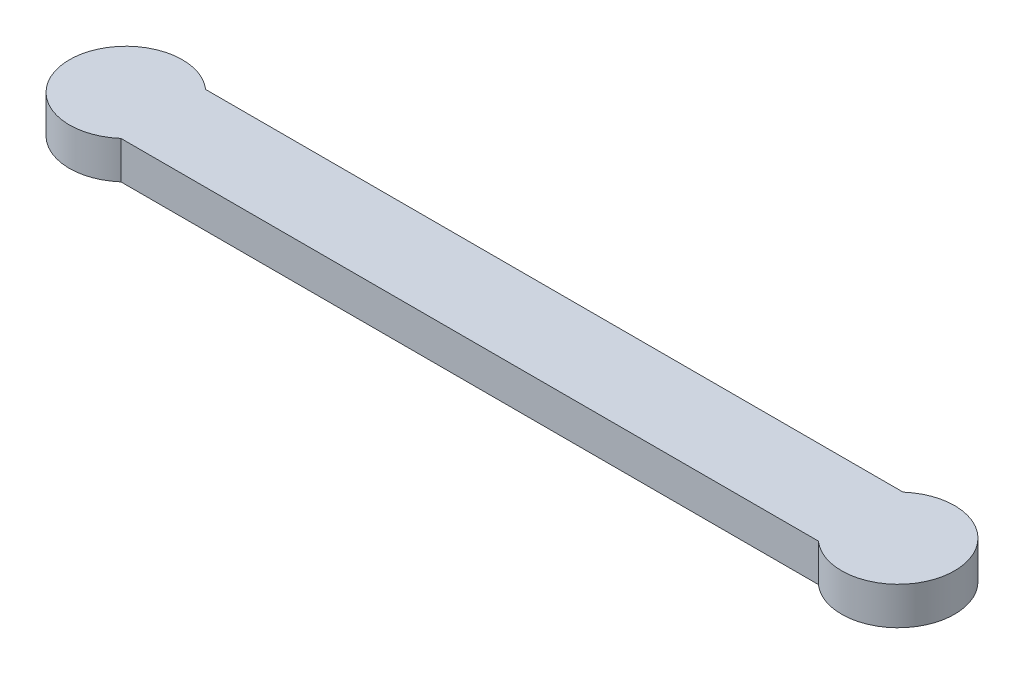
ISO-10303-21;
HEADER;
FILE_DESCRIPTION(('STEP AP214'),'2;1');
FILE_NAME('part.step','',(''),(''),'','','');
FILE_SCHEMA(('AUTOMOTIVE_DESIGN { 1 0 10303 214 1 1 1 1 }'));
ENDSEC;
DATA;
#1=APPLICATION_CONTEXT('core data for automotive mechanical design processes');
#2=APPLICATION_PROTOCOL_DEFINITION('international standard','automotive_design',2000,#1);
#3=PRODUCT_CONTEXT('',#1,'mechanical');
#4=PRODUCT('Part','Part','',(#3));
#5=PRODUCT_RELATED_PRODUCT_CATEGORY('part','',(#4));
#6=PRODUCT_DEFINITION_FORMATION('','',#4);
#7=PRODUCT_DEFINITION_CONTEXT('part definition',#1,'design');
#8=PRODUCT_DEFINITION('design','',#6,#7);
#9=PRODUCT_DEFINITION_SHAPE('','',#8);
#10=(LENGTH_UNIT() NAMED_UNIT(*) SI_UNIT(.MILLI.,.METRE.));
#11=(NAMED_UNIT(*) PLANE_ANGLE_UNIT() SI_UNIT($,.RADIAN.));
#12=(NAMED_UNIT(*) SI_UNIT($,.STERADIAN.) SOLID_ANGLE_UNIT());
#13=UNCERTAINTY_MEASURE_WITH_UNIT(LENGTH_MEASURE(1.E-05),#10,'distance_accuracy_value','');
#14=(GEOMETRIC_REPRESENTATION_CONTEXT(3) GLOBAL_UNCERTAINTY_ASSIGNED_CONTEXT((#13)) GLOBAL_UNIT_ASSIGNED_CONTEXT((#10,
#11,#12)) REPRESENTATION_CONTEXT('',''));
#15=CARTESIAN_POINT('',(0.,0.,0.));
#16=DIRECTION('',(0.,0.,1.));
#17=DIRECTION('',(1.,0.,0.));
#18=AXIS2_PLACEMENT_3D('',#15,#16,#17);
#19=CARTESIAN_POINT('',(0.,0.,0.));
#20=DIRECTION('',(0.,1.,0.));
#21=DIRECTION('',(0.,0.,1.));
#22=AXIS2_PLACEMENT_3D('',#19,#20,#21);
#23=PLANE('',#22);
#24=CARTESIAN_POINT('',(0.,0.,0.));
#25=DIRECTION('',(0.,1.,0.));
#26=DIRECTION('',(0.,0.,1.));
#27=AXIS2_PLACEMENT_3D('',#24,#25,#26);
#28=CIRCLE('',#27,6.);
#29=CARTESIAN_POINT('',(3.96862696659689,0.,-4.5));
#30=VERTEX_POINT('',#29);
#31=CARTESIAN_POINT('',(3.96862696659689,0.,4.5));
#32=VERTEX_POINT('',#31);
#33=EDGE_CURVE('E111',#30,#32,#28,.T.);
#34=ORIENTED_EDGE('',*,*,#33,.F.);
#35=DIRECTION('',(1.,0.,0.));
#36=VECTOR('',#35,1.);
#37=CARTESIAN_POINT('',(0.,0.,-4.5));
#38=LINE('',#37,#36);
#39=CARTESIAN_POINT('',(78.0313730334031,0.,-4.5));
#40=VERTEX_POINT('',#39);
#41=EDGE_CURVE('E137',#30,#40,#38,.T.);
#42=ORIENTED_EDGE('',*,*,#41,.T.);
#43=CARTESIAN_POINT('',(82.,0.,0.));
#44=DIRECTION('',(0.,1.,0.));
#45=DIRECTION('',(0.,0.,1.));
#46=AXIS2_PLACEMENT_3D('',#43,#44,#45);
#47=CIRCLE('',#46,6.);
#48=CARTESIAN_POINT('',(78.0313730334031,0.,4.5));
#49=VERTEX_POINT('',#48);
#50=EDGE_CURVE('E124',#49,#40,#47,.T.);
#51=ORIENTED_EDGE('',*,*,#50,.F.);
#52=DIRECTION('',(1.,0.,0.));
#53=VECTOR('',#52,1.);
#54=CARTESIAN_POINT('',(0.,0.,4.5));
#55=LINE('',#54,#53);
#56=EDGE_CURVE('E132',#32,#49,#55,.T.);
#57=ORIENTED_EDGE('',*,*,#56,.F.);
#58=EDGE_LOOP('',(#34,#42,#51,#57));
#59=FACE_BOUND('',#58,.T.);
#60=ADVANCED_FACE('F67',(#59),#23,.F.);
#61=CARTESIAN_POINT('',(0.,4.,4.5));
#62=DIRECTION('',(0.,0.,-1.));
#63=DIRECTION('',(-1.,0.,0.));
#64=AXIS2_PLACEMENT_3D('',#61,#62,#63);
#65=PLANE('',#64);
#66=ORIENTED_EDGE('',*,*,#56,.T.);
#67=DIRECTION('',(0.,-1.,0.));
#68=VECTOR('',#67,1.);
#69=CARTESIAN_POINT('',(78.0313730334031,4.,4.5));
#70=LINE('',#69,#68);
#71=CARTESIAN_POINT('',(78.0313730334031,4.,4.5));
#72=VERTEX_POINT('',#71);
#73=EDGE_CURVE('E116',#72,#49,#70,.T.);
#74=ORIENTED_EDGE('',*,*,#73,.F.);
#75=DIRECTION('',(1.,0.,0.));
#76=VECTOR('',#75,1.);
#77=CARTESIAN_POINT('',(0.,4.,4.5));
#78=LINE('',#77,#76);
#79=CARTESIAN_POINT('',(3.96862696659689,4.,4.5));
#80=VERTEX_POINT('',#79);
#81=EDGE_CURVE('E122',#80,#72,#78,.T.);
#82=ORIENTED_EDGE('',*,*,#81,.F.);
#83=DIRECTION('',(0.,-1.,0.));
#84=VECTOR('',#83,1.);
#85=CARTESIAN_POINT('',(3.96862696659689,4.,4.5));
#86=LINE('',#85,#84);
#87=EDGE_CURVE('E106',#80,#32,#86,.T.);
#88=ORIENTED_EDGE('',*,*,#87,.T.);
#89=EDGE_LOOP('',(#66,#74,#82,#88));
#90=FACE_BOUND('',#89,.T.);
#91=ADVANCED_FACE('F126',(#90),#65,.F.);
#92=CARTESIAN_POINT('',(0.,4.,0.));
#93=DIRECTION('',(0.,1.,0.));
#94=DIRECTION('',(0.,0.,1.));
#95=AXIS2_PLACEMENT_3D('',#92,#93,#94);
#96=PLANE('',#95);
#97=DIRECTION('',(1.,0.,0.));
#98=VECTOR('',#97,1.);
#99=CARTESIAN_POINT('',(0.,4.,-4.5));
#100=LINE('',#99,#98);
#101=CARTESIAN_POINT('',(3.96862696659689,4.,-4.5));
#102=VERTEX_POINT('',#101);
#103=CARTESIAN_POINT('',(78.0313730334031,4.,-4.5));
#104=VERTEX_POINT('',#103);
#105=EDGE_CURVE('E123',#102,#104,#100,.T.);
#106=ORIENTED_EDGE('',*,*,#105,.F.);
#107=CARTESIAN_POINT('',(0.,4.,0.));
#108=DIRECTION('',(0.,1.,0.));
#109=DIRECTION('',(0.,0.,1.));
#110=AXIS2_PLACEMENT_3D('',#107,#108,#109);
#111=CIRCLE('',#110,6.);
#112=EDGE_CURVE('E109',#102,#80,#111,.T.);
#113=ORIENTED_EDGE('',*,*,#112,.T.);
#114=ORIENTED_EDGE('',*,*,#81,.T.);
#115=CARTESIAN_POINT('',(82.,4.,0.));
#116=DIRECTION('',(0.,1.,0.));
#117=DIRECTION('',(0.,0.,1.));
#118=AXIS2_PLACEMENT_3D('',#115,#116,#117);
#119=CIRCLE('',#118,6.);
#120=EDGE_CURVE('E127',#72,#104,#119,.T.);
#121=ORIENTED_EDGE('',*,*,#120,.T.);
#122=EDGE_LOOP('',(#106,#113,#114,#121));
#123=FACE_BOUND('',#122,.T.);
#124=ADVANCED_FACE('F120',(#123),#96,.T.);
#125=CARTESIAN_POINT('',(0.,4.,0.));
#126=DIRECTION('',(0.,-1.,0.));
#127=DIRECTION('',(0.,0.,-1.));
#128=AXIS2_PLACEMENT_3D('',#125,#126,#127);
#129=CYLINDRICAL_SURFACE('',#128,6.);
#130=ORIENTED_EDGE('',*,*,#112,.F.);
#131=DIRECTION('',(0.,-1.,0.));
#132=VECTOR('',#131,1.);
#133=CARTESIAN_POINT('',(3.96862696659689,4.,-4.5));
#134=LINE('',#133,#132);
#135=EDGE_CURVE('E12',#102,#30,#134,.T.);
#136=ORIENTED_EDGE('',*,*,#135,.T.);
#137=ORIENTED_EDGE('',*,*,#33,.T.);
#138=ORIENTED_EDGE('',*,*,#87,.F.);
#139=EDGE_LOOP('',(#130,#136,#137,#138));
#140=FACE_BOUND('',#139,.T.);
#141=ADVANCED_FACE('F108',(#140),#129,.T.);
#142=CARTESIAN_POINT('',(82.,4.,0.));
#143=DIRECTION('',(0.,-1.,0.));
#144=DIRECTION('',(0.,0.,-1.));
#145=AXIS2_PLACEMENT_3D('',#142,#143,#144);
#146=CYLINDRICAL_SURFACE('',#145,6.);
#147=ORIENTED_EDGE('',*,*,#50,.T.);
#148=DIRECTION('',(0.,-1.,0.));
#149=VECTOR('',#148,1.);
#150=CARTESIAN_POINT('',(78.0313730334031,4.,-4.5));
#151=LINE('',#150,#149);
#152=EDGE_CURVE('E75',#40,#104,#151,.F.);
#153=ORIENTED_EDGE('',*,*,#152,.T.);
#154=ORIENTED_EDGE('',*,*,#120,.F.);
#155=ORIENTED_EDGE('',*,*,#73,.T.);
#156=EDGE_LOOP('',(#147,#153,#154,#155));
#157=FACE_BOUND('',#156,.T.);
#158=ADVANCED_FACE('F141',(#157),#146,.T.);
#159=CARTESIAN_POINT('',(0.,4.,-4.5));
#160=DIRECTION('',(0.,0.,-1.));
#161=DIRECTION('',(-1.,0.,0.));
#162=AXIS2_PLACEMENT_3D('',#159,#160,#161);
#163=PLANE('',#162);
#164=ORIENTED_EDGE('',*,*,#135,.F.);
#165=ORIENTED_EDGE('',*,*,#105,.T.);
#166=ORIENTED_EDGE('',*,*,#152,.F.);
#167=ORIENTED_EDGE('',*,*,#41,.F.);
#168=EDGE_LOOP('',(#164,#165,#166,#167));
#169=FACE_BOUND('',#168,.T.);
#170=ADVANCED_FACE('F69',(#169),#163,.T.);
#171=CLOSED_SHELL('',(#60,#91,#124,#141,#158,#170));
#172=MANIFOLD_SOLID_BREP('B2',#171);
#173=ADVANCED_BREP_SHAPE_REPRESENTATION('',(#18,#172),#14);
#174=SHAPE_DEFINITION_REPRESENTATION(#9,#173);
ENDSEC;
END-ISO-10303-21;
